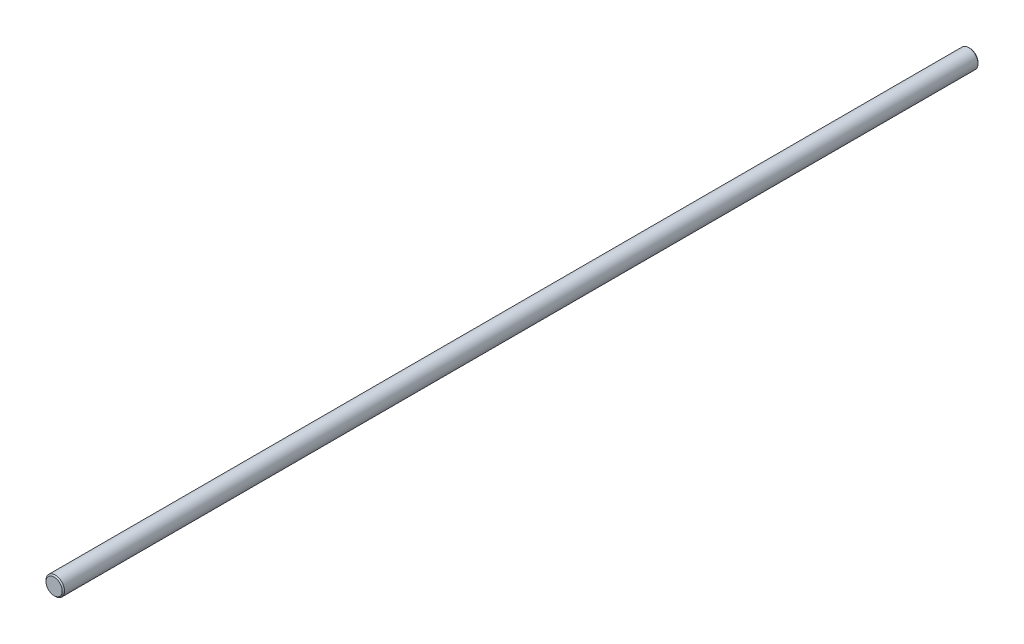
ISO-10303-21;
HEADER;
FILE_DESCRIPTION(('STEP AP214'),'2;1');
FILE_NAME('part.step','',(''),(''),'','','');
FILE_SCHEMA(('AUTOMOTIVE_DESIGN { 1 0 10303 214 1 1 1 1 }'));
ENDSEC;
DATA;
#1=APPLICATION_CONTEXT('core data for automotive mechanical design processes');
#2=APPLICATION_PROTOCOL_DEFINITION('international standard','automotive_design',2000,#1);
#3=PRODUCT_CONTEXT('',#1,'mechanical');
#4=PRODUCT('Part','Part','',(#3));
#5=PRODUCT_RELATED_PRODUCT_CATEGORY('part','',(#4));
#6=PRODUCT_DEFINITION_FORMATION('','',#4);
#7=PRODUCT_DEFINITION_CONTEXT('part definition',#1,'design');
#8=PRODUCT_DEFINITION('design','',#6,#7);
#9=PRODUCT_DEFINITION_SHAPE('','',#8);
#10=(LENGTH_UNIT() NAMED_UNIT(*) SI_UNIT(.MILLI.,.METRE.));
#11=(NAMED_UNIT(*) PLANE_ANGLE_UNIT() SI_UNIT($,.RADIAN.));
#12=(NAMED_UNIT(*) SI_UNIT($,.STERADIAN.) SOLID_ANGLE_UNIT());
#13=UNCERTAINTY_MEASURE_WITH_UNIT(LENGTH_MEASURE(1.E-05),#10,'distance_accuracy_value','');
#14=(GEOMETRIC_REPRESENTATION_CONTEXT(3) GLOBAL_UNCERTAINTY_ASSIGNED_CONTEXT((#13)) GLOBAL_UNIT_ASSIGNED_CONTEXT((#10,
#11,#12)) REPRESENTATION_CONTEXT('',''));
#15=CARTESIAN_POINT('',(0.,0.,0.));
#16=DIRECTION('',(0.,0.,1.));
#17=DIRECTION('',(1.,0.,0.));
#18=AXIS2_PLACEMENT_3D('',#15,#16,#17);
#19=CARTESIAN_POINT('',(0.,0.,395.));
#20=DIRECTION('',(0.,0.,-1.));
#21=DIRECTION('',(-1.,0.,0.));
#22=AXIS2_PLACEMENT_3D('',#19,#20,#21);
#23=CYLINDRICAL_SURFACE('',#22,4.);
#24=CARTESIAN_POINT('',(0.,0.,0.500000000000223));
#25=DIRECTION('',(0.,0.,1.));
#26=DIRECTION('',(1.,0.,0.));
#27=AXIS2_PLACEMENT_3D('',#24,#25,#26);
#28=CIRCLE('',#27,4.);
#29=CARTESIAN_POINT('',(4.,0.,0.500000000000223));
#30=VERTEX_POINT('',#29);
#31=EDGE_CURVE('E27',#30,#30,#28,.T.);
#32=ORIENTED_EDGE('',*,*,#31,.T.);
#33=EDGE_LOOP('',(#32));
#34=FACE_BOUND('',#33,.T.);
#35=CARTESIAN_POINT('',(0.,0.,394.5));
#36=DIRECTION('',(0.,0.,1.));
#37=DIRECTION('',(1.,0.,0.));
#38=AXIS2_PLACEMENT_3D('',#35,#36,#37);
#39=CIRCLE('',#38,4.);
#40=CARTESIAN_POINT('',(4.,0.,394.5));
#41=VERTEX_POINT('',#40);
#42=EDGE_CURVE('E28',#41,#41,#39,.F.);
#43=ORIENTED_EDGE('',*,*,#42,.T.);
#44=EDGE_LOOP('',(#43));
#45=FACE_BOUND('',#44,.T.);
#46=ADVANCED_FACE('F15',(#34,#45),#23,.T.);
#47=CARTESIAN_POINT('',(0.,0.,395.));
#48=DIRECTION('',(0.,0.,1.));
#49=DIRECTION('',(1.,0.,0.));
#50=AXIS2_PLACEMENT_3D('',#47,#48,#49);
#51=PLANE('',#50);
#52=CARTESIAN_POINT('',(0.,0.,395.));
#53=DIRECTION('',(0.,0.,1.));
#54=DIRECTION('',(1.,0.,0.));
#55=AXIS2_PLACEMENT_3D('',#52,#53,#54);
#56=CIRCLE('',#55,3.50000000000028);
#57=CARTESIAN_POINT('',(3.50000000000028,0.,395.));
#58=VERTEX_POINT('',#57);
#59=EDGE_CURVE('E10',#58,#58,#56,.T.);
#60=ORIENTED_EDGE('',*,*,#59,.T.);
#61=EDGE_LOOP('',(#60));
#62=FACE_BOUND('',#61,.T.);
#63=ADVANCED_FACE('F48',(#62),#51,.T.);
#64=CARTESIAN_POINT('',(0.,0.,0.));
#65=DIRECTION('',(0.,0.,1.));
#66=DIRECTION('',(1.,0.,0.));
#67=AXIS2_PLACEMENT_3D('',#64,#65,#66);
#68=PLANE('',#67);
#69=CARTESIAN_POINT('',(0.,0.,0.));
#70=DIRECTION('',(0.,0.,1.));
#71=DIRECTION('',(1.,0.,0.));
#72=AXIS2_PLACEMENT_3D('',#69,#70,#71);
#73=CIRCLE('',#72,3.49999999999978);
#74=CARTESIAN_POINT('',(3.49999999999978,0.,0.));
#75=VERTEX_POINT('',#74);
#76=EDGE_CURVE('E22',#75,#75,#73,.F.);
#77=ORIENTED_EDGE('',*,*,#76,.T.);
#78=EDGE_LOOP('',(#77));
#79=FACE_BOUND('',#78,.T.);
#80=ADVANCED_FACE('F44',(#79),#68,.F.);
#81=CARTESIAN_POINT('',(0.,0.,0.500000000000223));
#82=DIRECTION('',(0.,0.,1.));
#83=DIRECTION('',(1.,0.,0.));
#84=AXIS2_PLACEMENT_3D('',#81,#82,#83);
#85=CONICAL_SURFACE('',#84,4.,0.785398163397446);
#86=ORIENTED_EDGE('',*,*,#76,.F.);
#87=EDGE_LOOP('',(#86));
#88=FACE_BOUND('',#87,.T.);
#89=ORIENTED_EDGE('',*,*,#31,.F.);
#90=EDGE_LOOP('',(#89));
#91=FACE_BOUND('',#90,.T.);
#92=ADVANCED_FACE('F39',(#88,#91),#85,.T.);
#93=CARTESIAN_POINT('',(0.,0.,395.));
#94=DIRECTION('',(0.,0.,-1.));
#95=DIRECTION('',(-1.,0.,0.));
#96=AXIS2_PLACEMENT_3D('',#93,#94,#95);
#97=CONICAL_SURFACE('',#96,3.50000000000028,0.78539816339739);
#98=ORIENTED_EDGE('',*,*,#42,.F.);
#99=EDGE_LOOP('',(#98));
#100=FACE_BOUND('',#99,.T.);
#101=ORIENTED_EDGE('',*,*,#59,.F.);
#102=EDGE_LOOP('',(#101));
#103=FACE_BOUND('',#102,.T.);
#104=ADVANCED_FACE('F17',(#100,#103),#97,.T.);
#105=CLOSED_SHELL('',(#46,#63,#80,#92,#104));
#106=MANIFOLD_SOLID_BREP('B1',#105);
#107=ADVANCED_BREP_SHAPE_REPRESENTATION('',(#18,#106),#14);
#108=SHAPE_DEFINITION_REPRESENTATION(#9,#107);
ENDSEC;
END-ISO-10303-21;
